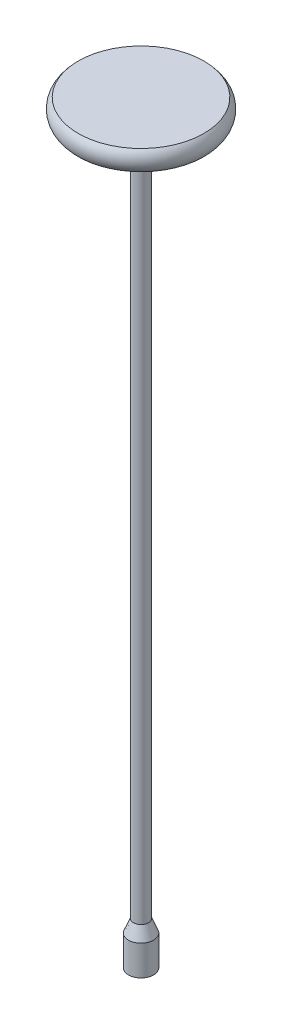
ISO-10303-21;
HEADER;
FILE_DESCRIPTION(('STEP AP214'),'2;1');
FILE_NAME('part.step','',(''),(''),'','','');
FILE_SCHEMA(('AUTOMOTIVE_DESIGN { 1 0 10303 214 1 1 1 1 }'));
ENDSEC;
DATA;
#1=APPLICATION_CONTEXT('core data for automotive mechanical design processes');
#2=APPLICATION_PROTOCOL_DEFINITION('international standard','automotive_design',2000,#1);
#3=PRODUCT_CONTEXT('',#1,'mechanical');
#4=PRODUCT('Part','Part','',(#3));
#5=PRODUCT_RELATED_PRODUCT_CATEGORY('part','',(#4));
#6=PRODUCT_DEFINITION_FORMATION('','',#4);
#7=PRODUCT_DEFINITION_CONTEXT('part definition',#1,'design');
#8=PRODUCT_DEFINITION('design','',#6,#7);
#9=PRODUCT_DEFINITION_SHAPE('','',#8);
#10=(LENGTH_UNIT() NAMED_UNIT(*) SI_UNIT(.MILLI.,.METRE.));
#11=(NAMED_UNIT(*) PLANE_ANGLE_UNIT() SI_UNIT($,.RADIAN.));
#12=(NAMED_UNIT(*) SI_UNIT($,.STERADIAN.) SOLID_ANGLE_UNIT());
#13=UNCERTAINTY_MEASURE_WITH_UNIT(LENGTH_MEASURE(1.E-05),#10,'distance_accuracy_value','');
#14=(GEOMETRIC_REPRESENTATION_CONTEXT(3) GLOBAL_UNCERTAINTY_ASSIGNED_CONTEXT((#13)) GLOBAL_UNIT_ASSIGNED_CONTEXT((#10,
#11,#12)) REPRESENTATION_CONTEXT('',''));
#15=CARTESIAN_POINT('',(0.,0.,0.));
#16=DIRECTION('',(0.,0.,1.));
#17=DIRECTION('',(1.,0.,0.));
#18=AXIS2_PLACEMENT_3D('',#15,#16,#17);
#19=CARTESIAN_POINT('',(0.,0.,0.));
#20=DIRECTION('',(0.,-1.,0.));
#21=DIRECTION('',(0.,0.,-1.));
#22=AXIS2_PLACEMENT_3D('',#19,#20,#21);
#23=CYLINDRICAL_SURFACE('',#22,5.);
#24=CARTESIAN_POINT('',(0.,317.232699925463,0.));
#25=DIRECTION('',(0.,-1.,0.));
#26=DIRECTION('',(0.,0.,-1.));
#27=AXIS2_PLACEMENT_3D('',#24,#25,#26);
#28=CIRCLE('',#27,5.);
#29=CARTESIAN_POINT('',(0.,317.232699925463,-5.));
#30=VERTEX_POINT('',#29);
#31=EDGE_CURVE('E10',#30,#30,#28,.T.);
#32=ORIENTED_EDGE('',*,*,#31,.F.);
#33=EDGE_LOOP('',(#32));
#34=FACE_BOUND('',#33,.T.);
#35=CARTESIAN_POINT('',(0.,327.232699925463,0.));
#36=DIRECTION('',(0.,-1.,0.));
#37=DIRECTION('',(0.,0.,-1.));
#38=AXIS2_PLACEMENT_3D('',#35,#36,#37);
#39=CIRCLE('',#38,5.);
#40=CARTESIAN_POINT('',(0.,327.232699925463,-5.));
#41=VERTEX_POINT('',#40);
#42=EDGE_CURVE('E85',#41,#41,#39,.T.);
#43=ORIENTED_EDGE('',*,*,#42,.T.);
#44=EDGE_LOOP('',(#43));
#45=FACE_BOUND('',#44,.T.);
#46=ADVANCED_FACE('F42',(#34,#45),#23,.T.);
#47=CARTESIAN_POINT('',(-5.,317.232699925463,0.));
#48=CARTESIAN_POINT('',(-3.99406900587572,317.337943309916,0.));
#49=CARTESIAN_POINT('',(-3.,317.520687178015,0.));
#50=B_SPLINE_CURVE_WITH_KNOTS('',2,(#47,#48,#49),.UNSPECIFIED.,.F.,.F.,(3,3),(0.,1.),.UNSPECIFIED.);
#51=CARTESIAN_POINT('',(0.,0.,0.));
#52=DIRECTION('',(0.,-1.,0.));
#53=AXIS1_PLACEMENT('',#51,#52);
#54=SURFACE_OF_REVOLUTION('',#50,#53);
#55=CARTESIAN_POINT('',(0.,317.520687178015,0.));
#56=DIRECTION('',(0.,-1.,0.));
#57=DIRECTION('',(0.,0.,-1.));
#58=AXIS2_PLACEMENT_3D('',#55,#56,#57);
#59=CIRCLE('',#58,3.);
#60=CARTESIAN_POINT('',(0.,317.520687178015,-3.));
#61=VERTEX_POINT('',#60);
#62=EDGE_CURVE('E49',#61,#61,#59,.T.);
#63=ORIENTED_EDGE('',*,*,#62,.F.);
#64=EDGE_LOOP('',(#63));
#65=FACE_BOUND('',#64,.T.);
#66=ORIENTED_EDGE('',*,*,#31,.T.);
#67=EDGE_LOOP('',(#66));
#68=FACE_BOUND('',#67,.T.);
#69=ADVANCED_FACE('F95',(#65,#68),#54,.T.);
#70=CARTESIAN_POINT('',(0.,0.,0.));
#71=DIRECTION('',(0.,-1.,0.));
#72=DIRECTION('',(0.,0.,-1.));
#73=AXIS2_PLACEMENT_3D('',#70,#71,#72);
#74=CYLINDRICAL_SURFACE('',#73,2.99999999999999);
#75=CARTESIAN_POINT('',(0.,52.2326999254626,0.));
#76=DIRECTION('',(0.,-1.,0.));
#77=DIRECTION('',(0.,0.,-1.));
#78=AXIS2_PLACEMENT_3D('',#75,#76,#77);
#79=CIRCLE('',#78,2.99999999999997);
#80=CARTESIAN_POINT('',(0.,52.2326999254626,-2.99999999999997));
#81=VERTEX_POINT('',#80);
#82=EDGE_CURVE('E54',#81,#81,#79,.T.);
#83=ORIENTED_EDGE('',*,*,#82,.F.);
#84=EDGE_LOOP('',(#83));
#85=FACE_BOUND('',#84,.T.);
#86=ORIENTED_EDGE('',*,*,#62,.T.);
#87=EDGE_LOOP('',(#86));
#88=FACE_BOUND('',#87,.T.);
#89=ADVANCED_FACE('F98',(#85,#88),#74,.T.);
#90=CARTESIAN_POINT('',(0.,52.2326999254626,0.));
#91=DIRECTION('',(0.,-1.,0.));
#92=DIRECTION('',(0.,0.,-1.));
#93=AXIS2_PLACEMENT_3D('',#90,#91,#92);
#94=CONICAL_SURFACE('',#93,2.99999999999997,0.38050637711237);
#95=CARTESIAN_POINT('',(0.,47.2326999254626,0.));
#96=DIRECTION('',(0.,-1.,0.));
#97=DIRECTION('',(0.,0.,-1.));
#98=AXIS2_PLACEMENT_3D('',#95,#96,#97);
#99=CIRCLE('',#98,5.);
#100=CARTESIAN_POINT('',(0.,47.2326999254626,-5.));
#101=VERTEX_POINT('',#100);
#102=EDGE_CURVE('E59',#101,#101,#99,.T.);
#103=ORIENTED_EDGE('',*,*,#102,.F.);
#104=EDGE_LOOP('',(#103));
#105=FACE_BOUND('',#104,.T.);
#106=ORIENTED_EDGE('',*,*,#82,.T.);
#107=EDGE_LOOP('',(#106));
#108=FACE_BOUND('',#107,.T.);
#109=ADVANCED_FACE('F102',(#105,#108),#94,.T.);
#110=CARTESIAN_POINT('',(0.,0.,0.));
#111=DIRECTION('',(0.,-1.,0.));
#112=DIRECTION('',(0.,0.,-1.));
#113=AXIS2_PLACEMENT_3D('',#110,#111,#112);
#114=CYLINDRICAL_SURFACE('',#113,5.);
#115=CARTESIAN_POINT('',(0.,35.2326999254626,0.));
#116=DIRECTION('',(0.,-1.,0.));
#117=DIRECTION('',(0.,0.,-1.));
#118=AXIS2_PLACEMENT_3D('',#115,#116,#117);
#119=CIRCLE('',#118,5.);
#120=CARTESIAN_POINT('',(0.,35.2326999254626,-5.));
#121=VERTEX_POINT('',#120);
#122=EDGE_CURVE('E65',#121,#121,#119,.T.);
#123=ORIENTED_EDGE('',*,*,#122,.F.);
#124=EDGE_LOOP('',(#123));
#125=FACE_BOUND('',#124,.T.);
#126=ORIENTED_EDGE('',*,*,#102,.T.);
#127=EDGE_LOOP('',(#126));
#128=FACE_BOUND('',#127,.T.);
#129=ADVANCED_FACE('F106',(#125,#128),#114,.T.);
#130=CARTESIAN_POINT('',(-2.44475966730985E-13,35.2326999254626,0.));
#131=DIRECTION('',(0.,1.,0.));
#132=DIRECTION('',(0.,0.,1.));
#133=AXIS2_PLACEMENT_3D('',#130,#131,#132);
#134=PLANE('',#133);
#135=CARTESIAN_POINT('',(0.,35.2326999254626,0.));
#136=DIRECTION('',(0.,-1.,0.));
#137=DIRECTION('',(0.,0.,-1.));
#138=AXIS2_PLACEMENT_3D('',#135,#136,#137);
#139=CIRCLE('',#138,4.);
#140=CARTESIAN_POINT('',(0.,35.2326999254626,-4.));
#141=VERTEX_POINT('',#140);
#142=EDGE_CURVE('E69',#141,#141,#139,.T.);
#143=ORIENTED_EDGE('',*,*,#142,.F.);
#144=EDGE_LOOP('',(#143));
#145=FACE_BOUND('',#144,.T.);
#146=ORIENTED_EDGE('',*,*,#122,.T.);
#147=EDGE_LOOP('',(#146));
#148=FACE_BOUND('',#147,.T.);
#149=ADVANCED_FACE('F110',(#145,#148),#134,.F.);
#150=CARTESIAN_POINT('',(0.,0.,0.));
#151=DIRECTION('',(0.,-1.,0.));
#152=DIRECTION('',(0.,0.,-1.));
#153=AXIS2_PLACEMENT_3D('',#150,#151,#152);
#154=CYLINDRICAL_SURFACE('',#153,4.);
#155=CARTESIAN_POINT('',(0.,46.2326999254626,0.));
#156=DIRECTION('',(0.,-1.,0.));
#157=DIRECTION('',(0.,0.,-1.));
#158=AXIS2_PLACEMENT_3D('',#155,#156,#157);
#159=CIRCLE('',#158,4.);
#160=CARTESIAN_POINT('',(0.,46.2326999254626,-4.));
#161=VERTEX_POINT('',#160);
#162=EDGE_CURVE('E73',#161,#161,#159,.T.);
#163=ORIENTED_EDGE('',*,*,#162,.F.);
#164=EDGE_LOOP('',(#163));
#165=FACE_BOUND('',#164,.T.);
#166=ORIENTED_EDGE('',*,*,#142,.T.);
#167=EDGE_LOOP('',(#166));
#168=FACE_BOUND('',#167,.T.);
#169=ADVANCED_FACE('F114',(#165,#168),#154,.F.);
#170=CARTESIAN_POINT('',(0.,46.2326999254626,0.));
#171=DIRECTION('',(0.,1.,0.));
#172=DIRECTION('',(0.,0.,1.));
#173=AXIS2_PLACEMENT_3D('',#170,#171,#172);
#174=PLANE('',#173);
#175=ORIENTED_EDGE('',*,*,#162,.T.);
#176=EDGE_LOOP('',(#175));
#177=FACE_BOUND('',#176,.T.);
#178=ADVANCED_FACE('F118',(#177),#174,.F.);
#179=CARTESIAN_POINT('',(0.,335.232699925463,0.));
#180=DIRECTION('',(0.,-1.,0.));
#181=DIRECTION('',(0.,0.,-1.));
#182=AXIS2_PLACEMENT_3D('',#179,#180,#181);
#183=PLANE('',#182);
#184=CARTESIAN_POINT('',(0.,335.232699925463,0.));
#185=DIRECTION('',(0.,-1.,0.));
#186=DIRECTION('',(0.,0.,-1.));
#187=AXIS2_PLACEMENT_3D('',#184,#185,#186);
#188=CIRCLE('',#187,25.);
#189=CARTESIAN_POINT('',(0.,335.232699925463,-25.));
#190=VERTEX_POINT('',#189);
#191=EDGE_CURVE('E77',#190,#190,#188,.T.);
#192=ORIENTED_EDGE('',*,*,#191,.F.);
#193=EDGE_LOOP('',(#192));
#194=FACE_BOUND('',#193,.T.);
#195=ADVANCED_FACE('F122',(#194),#183,.F.);
#196=CARTESIAN_POINT('',(0.,331.232699925463,0.));
#197=DIRECTION('',(0.,-1.,0.));
#198=DIRECTION('',(0.,0.,-1.));
#199=AXIS2_PLACEMENT_3D('',#196,#197,#198);
#200=TOROIDAL_SURFACE('',#199,20.9999999999999,5.65685424949245);
#201=ORIENTED_EDGE('',*,*,#191,.T.);
#202=EDGE_LOOP('',(#201));
#203=FACE_BOUND('',#202,.T.);
#204=CARTESIAN_POINT('',(0.,327.232699925463,0.));
#205=DIRECTION('',(0.,-1.,0.));
#206=DIRECTION('',(0.,0.,-1.));
#207=AXIS2_PLACEMENT_3D('',#204,#205,#206);
#208=CIRCLE('',#207,25.);
#209=CARTESIAN_POINT('',(0.,327.232699925463,-25.));
#210=VERTEX_POINT('',#209);
#211=EDGE_CURVE('E81',#210,#210,#208,.T.);
#212=ORIENTED_EDGE('',*,*,#211,.F.);
#213=EDGE_LOOP('',(#212));
#214=FACE_BOUND('',#213,.T.);
#215=ADVANCED_FACE('F126',(#203,#214),#200,.T.);
#216=CARTESIAN_POINT('',(0.,327.232699925463,0.));
#217=DIRECTION('',(0.,1.,0.));
#218=DIRECTION('',(0.,0.,1.));
#219=AXIS2_PLACEMENT_3D('',#216,#217,#218);
#220=PLANE('',#219);
#221=ORIENTED_EDGE('',*,*,#42,.F.);
#222=EDGE_LOOP('',(#221));
#223=FACE_BOUND('',#222,.T.);
#224=ORIENTED_EDGE('',*,*,#211,.T.);
#225=EDGE_LOOP('',(#224));
#226=FACE_BOUND('',#225,.T.);
#227=ADVANCED_FACE('F130',(#223,#226),#220,.F.);
#228=CLOSED_SHELL('',(#46,#69,#89,#109,#129,#149,#169,#178,#195,#215,#227));
#229=MANIFOLD_SOLID_BREP('B2',#228);
#230=ADVANCED_BREP_SHAPE_REPRESENTATION('',(#18,#229),#14);
#231=SHAPE_DEFINITION_REPRESENTATION(#9,#230);
ENDSEC;
END-ISO-10303-21;
